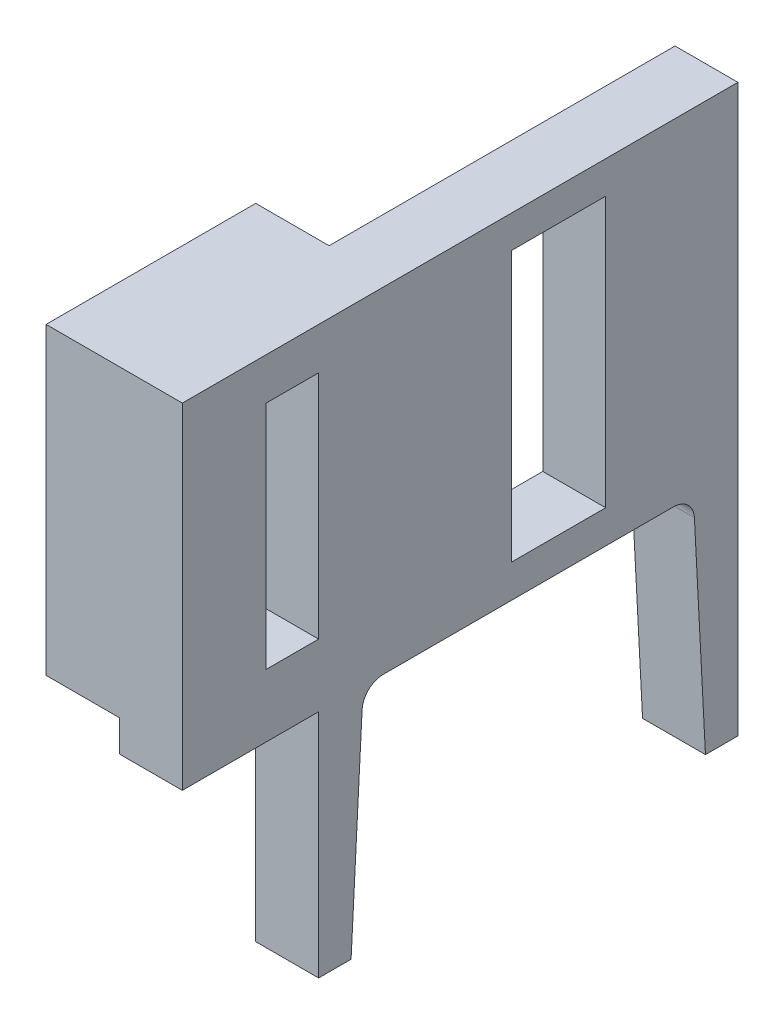
ISO-10303-21;
HEADER;
FILE_DESCRIPTION(('STEP AP214'),'2;1');
FILE_NAME('part.step','',(''),(''),'','','');
FILE_SCHEMA(('AUTOMOTIVE_DESIGN { 1 0 10303 214 1 1 1 1 }'));
ENDSEC;
DATA;
#1=APPLICATION_CONTEXT('core data for automotive mechanical design processes');
#2=APPLICATION_PROTOCOL_DEFINITION('international standard','automotive_design',2000,#1);
#3=PRODUCT_CONTEXT('',#1,'mechanical');
#4=PRODUCT('Part','Part','',(#3));
#5=PRODUCT_RELATED_PRODUCT_CATEGORY('part','',(#4));
#6=PRODUCT_DEFINITION_FORMATION('','',#4);
#7=PRODUCT_DEFINITION_CONTEXT('part definition',#1,'design');
#8=PRODUCT_DEFINITION('design','',#6,#7);
#9=PRODUCT_DEFINITION_SHAPE('','',#8);
#10=(LENGTH_UNIT() NAMED_UNIT(*) SI_UNIT(.MILLI.,.METRE.));
#11=(NAMED_UNIT(*) PLANE_ANGLE_UNIT() SI_UNIT($,.RADIAN.));
#12=(NAMED_UNIT(*) SI_UNIT($,.STERADIAN.) SOLID_ANGLE_UNIT());
#13=UNCERTAINTY_MEASURE_WITH_UNIT(LENGTH_MEASURE(1.E-05),#10,'distance_accuracy_value','');
#14=(GEOMETRIC_REPRESENTATION_CONTEXT(3) GLOBAL_UNCERTAINTY_ASSIGNED_CONTEXT((#13)) GLOBAL_UNIT_ASSIGNED_CONTEXT((#10,
#11,#12)) REPRESENTATION_CONTEXT('',''));
#15=CARTESIAN_POINT('',(0.,0.,0.));
#16=DIRECTION('',(0.,0.,1.));
#17=DIRECTION('',(1.,0.,0.));
#18=AXIS2_PLACEMENT_3D('',#15,#16,#17);
#19=CARTESIAN_POINT('',(13.,-16.,26.5));
#20=DIRECTION('',(0.,1.,0.));
#21=DIRECTION('',(0.,0.,1.));
#22=AXIS2_PLACEMENT_3D('',#19,#20,#21);
#23=PLANE('',#22);
#24=DIRECTION('',(-1.,0.,0.));
#25=VECTOR('',#24,1.);
#26=CARTESIAN_POINT('',(13.,-16.,26.5));
#27=LINE('',#26,#25);
#28=CARTESIAN_POINT('',(13.,-16.,26.5));
#29=VERTEX_POINT('',#28);
#30=CARTESIAN_POINT('',(7.00000000000001,-16.,26.5));
#31=VERTEX_POINT('',#30);
#32=EDGE_CURVE('E444',#29,#31,#27,.T.);
#33=ORIENTED_EDGE('',*,*,#32,.T.);
#34=DIRECTION('',(0.,0.,1.));
#35=VECTOR('',#34,1.);
#36=CARTESIAN_POINT('',(7.00000000000001,-16.,6.49999999999999));
#37=LINE('',#36,#35);
#38=CARTESIAN_POINT('',(7.00000000000001,-16.,13.5));
#39=VERTEX_POINT('',#38);
#40=EDGE_CURVE('E362',#39,#31,#37,.T.);
#41=ORIENTED_EDGE('',*,*,#40,.F.);
#42=DIRECTION('',(-1.,0.,0.));
#43=VECTOR('',#42,1.);
#44=CARTESIAN_POINT('',(13.,-16.,13.5));
#45=LINE('',#44,#43);
#46=CARTESIAN_POINT('',(13.,-16.,13.5));
#47=VERTEX_POINT('',#46);
#48=EDGE_CURVE('E405',#47,#39,#45,.T.);
#49=ORIENTED_EDGE('',*,*,#48,.F.);
#50=DIRECTION('',(0.,0.,-1.));
#51=VECTOR('',#50,1.);
#52=CARTESIAN_POINT('',(13.,-16.,26.5));
#53=LINE('',#52,#51);
#54=EDGE_CURVE('E441',#29,#47,#53,.T.);
#55=ORIENTED_EDGE('',*,*,#54,.F.);
#56=EDGE_LOOP('',(#33,#41,#49,#55));
#57=FACE_BOUND('',#56,.T.);
#58=ADVANCED_FACE('F33',(#57),#23,.F.);
#59=CARTESIAN_POINT('',(0.,0.,0.));
#60=DIRECTION('',(1.,0.,0.));
#61=DIRECTION('',(0.,0.,-1.));
#62=AXIS2_PLACEMENT_3D('',#59,#60,#61);
#63=PLANE('',#62);
#64=DIRECTION('',(0.,0.,1.));
#65=VECTOR('',#64,1.);
#66=CARTESIAN_POINT('',(0.,-10.,13.5));
#67=LINE('',#66,#65);
#68=CARTESIAN_POINT('',(0.,-10.,13.5));
#69=VERTEX_POINT('',#68);
#70=CARTESIAN_POINT('',(0.,-10.,18.5));
#71=VERTEX_POINT('',#70);
#72=EDGE_CURVE('E263',#69,#71,#67,.T.);
#73=ORIENTED_EDGE('',*,*,#72,.F.);
#74=DIRECTION('',(0.,-1.,0.));
#75=VECTOR('',#74,1.);
#76=CARTESIAN_POINT('',(0.,12.,13.5));
#77=LINE('',#76,#75);
#78=CARTESIAN_POINT('',(0.,12.,13.5));
#79=VERTEX_POINT('',#78);
#80=EDGE_CURVE('E48',#79,#69,#77,.T.);
#81=ORIENTED_EDGE('',*,*,#80,.F.);
#82=DIRECTION('',(0.,0.,-1.));
#83=VECTOR('',#82,1.);
#84=CARTESIAN_POINT('',(0.,12.,13.5));
#85=LINE('',#84,#83);
#86=CARTESIAN_POINT('',(0.,12.,18.5));
#87=VERTEX_POINT('',#86);
#88=EDGE_CURVE('E254',#87,#79,#85,.T.);
#89=ORIENTED_EDGE('',*,*,#88,.F.);
#90=DIRECTION('',(0.,1.,0.));
#91=VECTOR('',#90,1.);
#92=CARTESIAN_POINT('',(0.,12.,18.5));
#93=LINE('',#92,#91);
#94=EDGE_CURVE('E257',#71,#87,#93,.T.);
#95=ORIENTED_EDGE('',*,*,#94,.F.);
#96=EDGE_LOOP('',(#73,#81,#89,#95));
#97=FACE_BOUND('',#96,.T.);
#98=DIRECTION('',(0.,0.,-1.));
#99=VECTOR('',#98,1.);
#100=CARTESIAN_POINT('',(0.,-13.,6.49999999999999));
#101=LINE('',#100,#99);
#102=CARTESIAN_POINT('',(0.,-13.,26.5));
#103=VERTEX_POINT('',#102);
#104=CARTESIAN_POINT('',(0.,-13.,6.5));
#105=VERTEX_POINT('',#104);
#106=EDGE_CURVE('E374',#103,#105,#101,.T.);
#107=ORIENTED_EDGE('',*,*,#106,.F.);
#108=DIRECTION('',(0.,-1.,0.));
#109=VECTOR('',#108,1.);
#110=CARTESIAN_POINT('',(0.,16.,26.5));
#111=LINE('',#110,#109);
#112=CARTESIAN_POINT('',(0.,16.,26.5));
#113=VERTEX_POINT('',#112);
#114=EDGE_CURVE('E437',#113,#103,#111,.T.);
#115=ORIENTED_EDGE('',*,*,#114,.F.);
#116=DIRECTION('',(0.,0.,1.));
#117=VECTOR('',#116,1.);
#118=CARTESIAN_POINT('',(0.,16.,26.5));
#119=LINE('',#118,#117);
#120=CARTESIAN_POINT('',(0.,16.,6.49999999999999));
#121=VERTEX_POINT('',#120);
#122=EDGE_CURVE('E432',#121,#113,#119,.T.);
#123=ORIENTED_EDGE('',*,*,#122,.F.);
#124=DIRECTION('',(0.,1.,0.));
#125=VECTOR('',#124,1.);
#126=CARTESIAN_POINT('',(0.,-16.,6.5));
#127=LINE('',#126,#125);
#128=EDGE_CURVE('E386',#105,#121,#127,.T.);
#129=ORIENTED_EDGE('',*,*,#128,.F.);
#130=EDGE_LOOP('',(#107,#115,#123,#129));
#131=FACE_BOUND('',#130,.T.);
#132=ADVANCED_FACE('F538',(#97,#131),#63,.F.);
#133=CARTESIAN_POINT('',(0.,0.,6.5));
#134=DIRECTION('',(0.,0.,1.));
#135=DIRECTION('',(0.,-1.,0.));
#136=AXIS2_PLACEMENT_3D('',#133,#134,#135);
#137=PLANE('',#136);
#138=DIRECTION('',(1.,0.,0.));
#139=VECTOR('',#138,1.);
#140=CARTESIAN_POINT('',(7.00000000000001,-13.,6.49999999999999));
#141=LINE('',#140,#139);
#142=CARTESIAN_POINT('',(7.00000000000001,-13.,6.49999999999999));
#143=VERTEX_POINT('',#142);
#144=EDGE_CURVE('E376',#105,#143,#141,.T.);
#145=ORIENTED_EDGE('',*,*,#144,.F.);
#146=ORIENTED_EDGE('',*,*,#128,.T.);
#147=DIRECTION('',(1.,0.,0.));
#148=VECTOR('',#147,1.);
#149=CARTESIAN_POINT('',(7.00000000000001,16.,6.49999999999999));
#150=LINE('',#149,#148);
#151=CARTESIAN_POINT('',(7.00000000000001,16.,6.49999999999999));
#152=VERTEX_POINT('',#151);
#153=EDGE_CURVE('E388',#121,#152,#150,.T.);
#154=ORIENTED_EDGE('',*,*,#153,.T.);
#155=DIRECTION('',(0.,-1.,0.));
#156=VECTOR('',#155,1.);
#157=CARTESIAN_POINT('',(7.00000000000001,-16.,6.5));
#158=LINE('',#157,#156);
#159=EDGE_CURVE('E383',#152,#143,#158,.T.);
#160=ORIENTED_EDGE('',*,*,#159,.T.);
#161=EDGE_LOOP('',(#145,#146,#154,#160));
#162=FACE_BOUND('',#161,.T.);
#163=ADVANCED_FACE('F540',(#162),#137,.F.);
#164=CARTESIAN_POINT('',(7.,-16.,-26.5));
#165=DIRECTION('',(1.,0.,0.));
#166=DIRECTION('',(0.,0.,-1.));
#167=AXIS2_PLACEMENT_3D('',#164,#165,#166);
#168=PLANE('',#167);
#169=DIRECTION('',(0.,0.,-1.));
#170=VECTOR('',#169,1.);
#171=CARTESIAN_POINT('',(7.,12.9015711105183,-15.8814467422432));
#172=LINE('',#171,#170);
#173=CARTESIAN_POINT('',(7.,12.9015711105183,-15.8814467422432));
#174=VERTEX_POINT('',#173);
#175=CARTESIAN_POINT('',(7.,12.9015711105183,-24.5315578763154));
#176=VERTEX_POINT('',#175);
#177=EDGE_CURVE('E288',#174,#176,#172,.T.);
#178=ORIENTED_EDGE('',*,*,#177,.F.);
#179=DIRECTION('',(0.,1.,0.));
#180=VECTOR('',#179,1.);
#181=CARTESIAN_POINT('',(7.,12.9015711105183,-15.8814467422432));
#182=LINE('',#181,#180);
#183=CARTESIAN_POINT('',(7.,-13.1087867617339,-15.8814467422432));
#184=VERTEX_POINT('',#183);
#185=EDGE_CURVE('E269',#184,#174,#182,.T.);
#186=ORIENTED_EDGE('',*,*,#185,.F.);
#187=DIRECTION('',(0.,0.,1.));
#188=VECTOR('',#187,1.);
#189=CARTESIAN_POINT('',(7.,-13.1087867617339,-15.8814467422432));
#190=LINE('',#189,#188);
#191=CARTESIAN_POINT('',(7.,-13.1087867617339,-24.5315578763154));
#192=VERTEX_POINT('',#191);
#193=EDGE_CURVE('E277',#192,#184,#190,.T.);
#194=ORIENTED_EDGE('',*,*,#193,.F.);
#195=DIRECTION('',(0.,-1.,0.));
#196=VECTOR('',#195,1.);
#197=CARTESIAN_POINT('',(7.,12.9015711105183,-24.5315578763154));
#198=LINE('',#197,#196);
#199=EDGE_CURVE('E291',#176,#192,#198,.T.);
#200=ORIENTED_EDGE('',*,*,#199,.F.);
#201=EDGE_LOOP('',(#178,#186,#194,#200));
#202=FACE_BOUND('',#201,.T.);
#203=DIRECTION('',(0.,0.,1.));
#204=VECTOR('',#203,1.);
#205=CARTESIAN_POINT('',(7.,-13.,-3.61894400909035));
#206=LINE('',#205,#204);
#207=CARTESIAN_POINT('',(7.,-13.,-3.61894400909035));
#208=VERTEX_POINT('',#207);
#209=CARTESIAN_POINT('',(7.,-13.,4.89292863101165));
#210=VERTEX_POINT('',#209);
#211=EDGE_CURVE('E320',#208,#210,#206,.T.);
#212=ORIENTED_EDGE('',*,*,#211,.F.);
#213=DIRECTION('',(0.,-1.,0.));
#214=VECTOR('',#213,1.);
#215=CARTESIAN_POINT('',(7.,12.6981992928279,-3.61894400909035));
#216=LINE('',#215,#214);
#217=CARTESIAN_POINT('',(7.,12.6981992928279,-3.61894400909035));
#218=VERTEX_POINT('',#217);
#219=EDGE_CURVE('E298',#218,#208,#216,.T.);
#220=ORIENTED_EDGE('',*,*,#219,.F.);
#221=DIRECTION('',(0.,0.,-1.));
#222=VECTOR('',#221,1.);
#223=CARTESIAN_POINT('',(7.,12.6981992928279,-3.61894400909035));
#224=LINE('',#223,#222);
#225=CARTESIAN_POINT('',(7.,12.6981992928279,4.89292863101165));
#226=VERTEX_POINT('',#225);
#227=EDGE_CURVE('E309',#226,#218,#224,.T.);
#228=ORIENTED_EDGE('',*,*,#227,.F.);
#229=DIRECTION('',(0.,1.,0.));
#230=VECTOR('',#229,1.);
#231=CARTESIAN_POINT('',(7.,12.6981992928279,4.89292863101165));
#232=LINE('',#231,#230);
#233=EDGE_CURVE('E323',#210,#226,#232,.T.);
#234=ORIENTED_EDGE('',*,*,#233,.F.);
#235=EDGE_LOOP('',(#212,#220,#228,#234));
#236=FACE_BOUND('',#235,.T.);
#237=DIRECTION('',(0.,0.,1.));
#238=VECTOR('',#237,1.);
#239=CARTESIAN_POINT('',(7.,-12.8405154349878,-13.8814467422432));
#240=LINE('',#239,#238);
#241=CARTESIAN_POINT('',(7.,-12.8405154349878,-13.8814467422432));
#242=VERTEX_POINT('',#241);
#243=CARTESIAN_POINT('',(7.,-12.8405154349878,-4.88144674224323));
#244=VERTEX_POINT('',#243);
#245=EDGE_CURVE('E352',#242,#244,#240,.T.);
#246=ORIENTED_EDGE('',*,*,#245,.F.);
#247=DIRECTION('',(0.,-1.,0.));
#248=VECTOR('',#247,1.);
#249=CARTESIAN_POINT('',(7.,12.9015711105183,-13.8814467422432));
#250=LINE('',#249,#248);
#251=CARTESIAN_POINT('',(7.,12.9015711105183,-13.8814467422432));
#252=VERTEX_POINT('',#251);
#253=EDGE_CURVE('E330',#252,#242,#250,.T.);
#254=ORIENTED_EDGE('',*,*,#253,.F.);
#255=DIRECTION('',(0.,0.,-1.));
#256=VECTOR('',#255,1.);
#257=CARTESIAN_POINT('',(7.,12.9015711105183,-13.8814467422432));
#258=LINE('',#257,#256);
#259=CARTESIAN_POINT('',(7.,12.9015711105183,-4.88144674224324));
#260=VERTEX_POINT('',#259);
#261=EDGE_CURVE('E341',#260,#252,#258,.T.);
#262=ORIENTED_EDGE('',*,*,#261,.F.);
#263=DIRECTION('',(0.,1.,0.));
#264=VECTOR('',#263,1.);
#265=CARTESIAN_POINT('',(7.,12.9015711105183,-4.88144674224324));
#266=LINE('',#265,#264);
#267=EDGE_CURVE('E355',#244,#260,#266,.T.);
#268=ORIENTED_EDGE('',*,*,#267,.F.);
#269=EDGE_LOOP('',(#246,#254,#262,#268));
#270=FACE_BOUND('',#269,.T.);
#271=ORIENTED_EDGE('',*,*,#159,.F.);
#272=DIRECTION('',(0.,0.,-1.));
#273=VECTOR('',#272,1.);
#274=CARTESIAN_POINT('',(7.,16.,-26.5));
#275=LINE('',#274,#273);
#276=CARTESIAN_POINT('',(7.,16.,-26.5));
#277=VERTEX_POINT('',#276);
#278=EDGE_CURVE('E427',#152,#277,#275,.T.);
#279=ORIENTED_EDGE('',*,*,#278,.T.);
#280=DIRECTION('',(0.,1.,0.));
#281=VECTOR('',#280,1.);
#282=CARTESIAN_POINT('',(7.,-16.,-26.5));
#283=LINE('',#282,#281);
#284=CARTESIAN_POINT('',(7.,-38.,-26.5));
#285=VERTEX_POINT('',#284);
#286=EDGE_CURVE('E429',#285,#277,#283,.T.);
#287=ORIENTED_EDGE('',*,*,#286,.F.);
#288=DIRECTION('',(0.,0.,-1.));
#289=VECTOR('',#288,1.);
#290=CARTESIAN_POINT('',(7.,-38.,-26.5));
#291=LINE('',#290,#289);
#292=CARTESIAN_POINT('',(7.,-38.,-23.4029711442269));
#293=VERTEX_POINT('',#292);
#294=EDGE_CURVE('E412',#293,#285,#291,.T.);
#295=ORIENTED_EDGE('',*,*,#294,.F.);
#296=DIRECTION('',(0.,0.998629534754574,0.052335956242944));
#297=VECTOR('',#296,1.);
#298=CARTESIAN_POINT('',(7.,-16.2221229844438,-22.2616409723424));
#299=LINE('',#298,#297);
#300=CARTESIAN_POINT('',(7.,-17.8953280875141,-22.3493299360794));
#301=VERTEX_POINT('',#300);
#302=EDGE_CURVE('E395',#301,#293,#299,.F.);
#303=ORIENTED_EDGE('',*,*,#302,.F.);
#304=CARTESIAN_POINT('',(7.,-18.,-20.3520708665702));
#305=DIRECTION('',(1.,0.,0.));
#306=DIRECTION('',(0.,0.,-1.));
#307=AXIS2_PLACEMENT_3D('',#304,#305,#306);
#308=CIRCLE('',#307,2.);
#309=CARTESIAN_POINT('',(7.00000000000001,-16.,-20.3520708665702));
#310=VERTEX_POINT('',#309);
#311=EDGE_CURVE('E470',#310,#301,#308,.F.);
#312=ORIENTED_EDGE('',*,*,#311,.F.);
#313=DIRECTION('',(0.,0.,-1.));
#314=VECTOR('',#313,1.);
#315=CARTESIAN_POINT('',(7.00000000000001,-16.,9.25));
#316=LINE('',#315,#314);
#317=CARTESIAN_POINT('',(7.00000000000001,-16.,7.35207086657024));
#318=VERTEX_POINT('',#317);
#319=EDGE_CURVE('E393',#318,#310,#316,.T.);
#320=ORIENTED_EDGE('',*,*,#319,.F.);
#321=CARTESIAN_POINT('',(7.,-18.,7.35207086657024));
#322=DIRECTION('',(1.,0.,0.));
#323=DIRECTION('',(0.,0.,-1.));
#324=AXIS2_PLACEMENT_3D('',#321,#322,#323);
#325=CIRCLE('',#324,2.);
#326=CARTESIAN_POINT('',(7.,-17.8953280875141,9.34932993607939));
#327=VERTEX_POINT('',#326);
#328=EDGE_CURVE('E11',#327,#318,#325,.F.);
#329=ORIENTED_EDGE('',*,*,#328,.F.);
#330=DIRECTION('',(0.,-0.998629534754574,0.052335956242944));
#331=VECTOR('',#330,1.);
#332=CARTESIAN_POINT('',(7.,-14.1315537190907,9.15207887970789));
#333=LINE('',#332,#331);
#334=CARTESIAN_POINT('',(7.,-38.,10.4029711442269));
#335=VERTEX_POINT('',#334);
#336=EDGE_CURVE('E399',#335,#327,#333,.F.);
#337=ORIENTED_EDGE('',*,*,#336,.F.);
#338=CARTESIAN_POINT('',(7.00000000000001,-38.,13.5));
#339=VERTEX_POINT('',#338);
#340=EDGE_CURVE('E413',#339,#335,#291,.T.);
#341=ORIENTED_EDGE('',*,*,#340,.F.);
#342=DIRECTION('',(0.,1.,0.));
#343=VECTOR('',#342,1.);
#344=CARTESIAN_POINT('',(7.00000000000001,-38.,13.5));
#345=LINE('',#344,#343);
#346=EDGE_CURVE('E419',#339,#39,#345,.T.);
#347=ORIENTED_EDGE('',*,*,#346,.T.);
#348=ORIENTED_EDGE('',*,*,#40,.T.);
#349=DIRECTION('',(0.,-1.,0.));
#350=VECTOR('',#349,1.);
#351=CARTESIAN_POINT('',(7.00000000000001,-13.,26.5));
#352=LINE('',#351,#350);
#353=CARTESIAN_POINT('',(7.00000000000001,-13.,26.5));
#354=VERTEX_POINT('',#353);
#355=EDGE_CURVE('E379',#354,#31,#352,.T.);
#356=ORIENTED_EDGE('',*,*,#355,.F.);
#357=DIRECTION('',(0.,0.,1.));
#358=VECTOR('',#357,1.);
#359=CARTESIAN_POINT('',(7.00000000000001,-13.,6.49999999999999));
#360=LINE('',#359,#358);
#361=EDGE_CURVE('E369',#143,#354,#360,.T.);
#362=ORIENTED_EDGE('',*,*,#361,.F.);
#363=EDGE_LOOP('',(#271,#279,#287,#295,#303,#312,#320,#329,#337,#341,#347,#348,#356,#362));
#364=FACE_BOUND('',#363,.T.);
#365=ADVANCED_FACE('F496',(#202,#236,#270,#364),#168,.F.);
#366=CARTESIAN_POINT('',(0.,-18.,7.35207086657024));
#367=DIRECTION('',(1.,0.,0.));
#368=DIRECTION('',(0.,0.,-1.));
#369=AXIS2_PLACEMENT_3D('',#366,#367,#368);
#370=CYLINDRICAL_SURFACE('',#369,2.);
#371=DIRECTION('',(1.,0.,0.));
#372=VECTOR('',#371,1.);
#373=CARTESIAN_POINT('',(0.,-16.,7.35207086657024));
#374=LINE('',#373,#372);
#375=CARTESIAN_POINT('',(13.,-16.,7.35207086657024));
#376=VERTEX_POINT('',#375);
#377=EDGE_CURVE('E472',#376,#318,#374,.F.);
#378=ORIENTED_EDGE('',*,*,#377,.F.);
#379=CARTESIAN_POINT('',(13.,-18.,7.35207086657024));
#380=DIRECTION('',(1.,0.,0.));
#381=DIRECTION('',(0.,0.,-1.));
#382=AXIS2_PLACEMENT_3D('',#379,#380,#381);
#383=CIRCLE('',#382,2.);
#384=CARTESIAN_POINT('',(13.,-17.8953280875141,9.34932993607939));
#385=VERTEX_POINT('',#384);
#386=EDGE_CURVE('E41',#376,#385,#383,.T.);
#387=ORIENTED_EDGE('',*,*,#386,.T.);
#388=DIRECTION('',(-1.,0.,0.));
#389=VECTOR('',#388,1.);
#390=CARTESIAN_POINT('',(13.,-17.8953280875141,9.34932993607939));
#391=LINE('',#390,#389);
#392=EDGE_CURVE('E475',#327,#385,#391,.F.);
#393=ORIENTED_EDGE('',*,*,#392,.F.);
#394=ORIENTED_EDGE('',*,*,#328,.T.);
#395=EDGE_LOOP('',(#378,#387,#393,#394));
#396=FACE_BOUND('',#395,.T.);
#397=ADVANCED_FACE('F35',(#396),#370,.F.);
#398=CARTESIAN_POINT('',(13.,-18.,-20.3520708665702));
#399=DIRECTION('',(1.,0.,0.));
#400=DIRECTION('',(0.,0.,-1.));
#401=AXIS2_PLACEMENT_3D('',#398,#399,#400);
#402=CYLINDRICAL_SURFACE('',#401,2.);
#403=DIRECTION('',(-1.,0.,0.));
#404=VECTOR('',#403,1.);
#405=CARTESIAN_POINT('',(13.,-17.8953280875141,-22.3493299360794));
#406=LINE('',#405,#404);
#407=CARTESIAN_POINT('',(13.,-17.8953280875141,-22.3493299360794));
#408=VERTEX_POINT('',#407);
#409=EDGE_CURVE('E462',#408,#301,#406,.T.);
#410=ORIENTED_EDGE('',*,*,#409,.F.);
#411=CARTESIAN_POINT('',(13.,-18.,-20.3520708665702));
#412=DIRECTION('',(1.,0.,0.));
#413=DIRECTION('',(0.,0.,-1.));
#414=AXIS2_PLACEMENT_3D('',#411,#412,#413);
#415=CIRCLE('',#414,2.);
#416=CARTESIAN_POINT('',(13.,-16.,-20.3520708665702));
#417=VERTEX_POINT('',#416);
#418=EDGE_CURVE('E468',#408,#417,#415,.T.);
#419=ORIENTED_EDGE('',*,*,#418,.T.);
#420=DIRECTION('',(1.,0.,0.));
#421=VECTOR('',#420,1.);
#422=CARTESIAN_POINT('',(0.,-16.,-20.3520708665702));
#423=LINE('',#422,#421);
#424=EDGE_CURVE('E465',#310,#417,#423,.T.);
#425=ORIENTED_EDGE('',*,*,#424,.F.);
#426=ORIENTED_EDGE('',*,*,#311,.T.);
#427=EDGE_LOOP('',(#410,#419,#425,#426));
#428=FACE_BOUND('',#427,.T.);
#429=ADVANCED_FACE('F506',(#428),#402,.F.);
#430=CARTESIAN_POINT('',(13.,0.,0.));
#431=DIRECTION('',(1.,0.,0.));
#432=DIRECTION('',(0.,0.,-1.));
#433=AXIS2_PLACEMENT_3D('',#430,#431,#432);
#434=PLANE('',#433);
#435=DIRECTION('',(0.,-1.,0.));
#436=VECTOR('',#435,1.);
#437=CARTESIAN_POINT('',(13.,12.,13.5));
#438=LINE('',#437,#436);
#439=CARTESIAN_POINT('',(13.,12.,13.5));
#440=VERTEX_POINT('',#439);
#441=CARTESIAN_POINT('',(13.,-10.,13.5));
#442=VERTEX_POINT('',#441);
#443=EDGE_CURVE('E238',#440,#442,#438,.T.);
#444=ORIENTED_EDGE('',*,*,#443,.T.);
#445=DIRECTION('',(0.,0.,1.));
#446=VECTOR('',#445,1.);
#447=CARTESIAN_POINT('',(13.,-10.,13.5));
#448=LINE('',#447,#446);
#449=CARTESIAN_POINT('',(13.,-10.,18.5));
#450=VERTEX_POINT('',#449);
#451=EDGE_CURVE('E247',#442,#450,#448,.T.);
#452=ORIENTED_EDGE('',*,*,#451,.T.);
#453=DIRECTION('',(0.,1.,0.));
#454=VECTOR('',#453,1.);
#455=CARTESIAN_POINT('',(13.,12.,18.5));
#456=LINE('',#455,#454);
#457=CARTESIAN_POINT('',(13.,12.,18.5));
#458=VERTEX_POINT('',#457);
#459=EDGE_CURVE('E56',#450,#458,#456,.T.);
#460=ORIENTED_EDGE('',*,*,#459,.T.);
#461=DIRECTION('',(0.,0.,-1.));
#462=VECTOR('',#461,1.);
#463=CARTESIAN_POINT('',(13.,12.,13.5));
#464=LINE('',#463,#462);
#465=EDGE_CURVE('E244',#458,#440,#464,.T.);
#466=ORIENTED_EDGE('',*,*,#465,.T.);
#467=EDGE_LOOP('',(#444,#452,#460,#466));
#468=FACE_BOUND('',#467,.T.);
#469=DIRECTION('',(0.,-1.,0.));
#470=VECTOR('',#469,1.);
#471=CARTESIAN_POINT('',(13.,12.9015711105183,-13.8814467422432));
#472=LINE('',#471,#470);
#473=CARTESIAN_POINT('',(13.,12.9015711105183,-13.8814467422432));
#474=VERTEX_POINT('',#473);
#475=CARTESIAN_POINT('',(13.,-12.8405154349878,-13.8814467422432));
#476=VERTEX_POINT('',#475);
#477=EDGE_CURVE('E337',#474,#476,#472,.T.);
#478=ORIENTED_EDGE('',*,*,#477,.T.);
#479=DIRECTION('',(0.,0.,1.));
#480=VECTOR('',#479,1.);
#481=CARTESIAN_POINT('',(13.,-12.8405154349878,-13.8814467422432));
#482=LINE('',#481,#480);
#483=CARTESIAN_POINT('',(13.,-12.8405154349878,-4.88144674224323));
#484=VERTEX_POINT('',#483);
#485=EDGE_CURVE('E340',#476,#484,#482,.T.);
#486=ORIENTED_EDGE('',*,*,#485,.T.);
#487=DIRECTION('',(0.,1.,0.));
#488=VECTOR('',#487,1.);
#489=CARTESIAN_POINT('',(13.,12.9015711105183,-4.88144674224324));
#490=LINE('',#489,#488);
#491=CARTESIAN_POINT('',(13.,12.9015711105183,-4.88144674224324));
#492=VERTEX_POINT('',#491);
#493=EDGE_CURVE('E344',#484,#492,#490,.T.);
#494=ORIENTED_EDGE('',*,*,#493,.T.);
#495=DIRECTION('',(0.,0.,-1.));
#496=VECTOR('',#495,1.);
#497=CARTESIAN_POINT('',(13.,12.9015711105183,-13.8814467422432));
#498=LINE('',#497,#496);
#499=EDGE_CURVE('E347',#492,#474,#498,.T.);
#500=ORIENTED_EDGE('',*,*,#499,.T.);
#501=EDGE_LOOP('',(#478,#486,#494,#500));
#502=FACE_BOUND('',#501,.T.);
#503=ORIENTED_EDGE('',*,*,#418,.F.);
#504=DIRECTION('',(0.,0.998629534754574,0.052335956242944));
#505=VECTOR('',#504,1.);
#506=CARTESIAN_POINT('',(13.,1.11905431679883,-21.3528283798308));
#507=LINE('',#506,#505);
#508=CARTESIAN_POINT('',(13.,-38.,-23.4029711442269));
#509=VERTEX_POINT('',#508);
#510=EDGE_CURVE('E397',#408,#509,#507,.F.);
#511=ORIENTED_EDGE('',*,*,#510,.T.);
#512=DIRECTION('',(0.,0.,1.));
#513=VECTOR('',#512,1.);
#514=CARTESIAN_POINT('',(13.,-38.,-26.5));
#515=LINE('',#514,#513);
#516=CARTESIAN_POINT('',(13.,-38.,-26.5));
#517=VERTEX_POINT('',#516);
#518=EDGE_CURVE('E406',#517,#509,#515,.T.);
#519=ORIENTED_EDGE('',*,*,#518,.F.);
#520=DIRECTION('',(0.,1.,0.));
#521=VECTOR('',#520,1.);
#522=CARTESIAN_POINT('',(13.,16.,-26.5));
#523=LINE('',#522,#521);
#524=CARTESIAN_POINT('',(13.,16.,-26.5));
#525=VERTEX_POINT('',#524);
#526=EDGE_CURVE('E433',#517,#525,#523,.T.);
#527=ORIENTED_EDGE('',*,*,#526,.T.);
#528=DIRECTION('',(0.,0.,1.));
#529=VECTOR('',#528,1.);
#530=CARTESIAN_POINT('',(13.,16.,26.5));
#531=LINE('',#530,#529);
#532=CARTESIAN_POINT('',(13.,16.,26.5));
#533=VERTEX_POINT('',#532);
#534=EDGE_CURVE('E436',#525,#533,#531,.T.);
#535=ORIENTED_EDGE('',*,*,#534,.T.);
#536=DIRECTION('',(0.,-1.,0.));
#537=VECTOR('',#536,1.);
#538=CARTESIAN_POINT('',(13.,16.,26.5));
#539=LINE('',#538,#537);
#540=EDGE_CURVE('E439',#533,#29,#539,.T.);
#541=ORIENTED_EDGE('',*,*,#540,.T.);
#542=ORIENTED_EDGE('',*,*,#54,.T.);
#543=DIRECTION('',(0.,1.,0.));
#544=VECTOR('',#543,1.);
#545=CARTESIAN_POINT('',(13.,-38.,13.5));
#546=LINE('',#545,#544);
#547=CARTESIAN_POINT('',(13.,-38.,13.5));
#548=VERTEX_POINT('',#547);
#549=EDGE_CURVE('E424',#548,#47,#546,.T.);
#550=ORIENTED_EDGE('',*,*,#549,.F.);
#551=CARTESIAN_POINT('',(13.,-38.,10.4029711442269));
#552=VERTEX_POINT('',#551);
#553=EDGE_CURVE('E410',#552,#548,#515,.T.);
#554=ORIENTED_EDGE('',*,*,#553,.F.);
#555=DIRECTION('',(0.,-0.998629534754574,0.052335956242944));
#556=VECTOR('',#555,1.);
#557=CARTESIAN_POINT('',(13.,0.439619305559085,8.38843605993703));
#558=LINE('',#557,#556);
#559=EDGE_CURVE('E402',#552,#385,#558,.F.);
#560=ORIENTED_EDGE('',*,*,#559,.T.);
#561=ORIENTED_EDGE('',*,*,#386,.F.);
#562=DIRECTION('',(0.,0.,1.));
#563=VECTOR('',#562,1.);
#564=CARTESIAN_POINT('',(13.,-16.,9.25));
#565=LINE('',#564,#563);
#566=EDGE_CURVE('E390',#417,#376,#565,.T.);
#567=ORIENTED_EDGE('',*,*,#566,.F.);
#568=EDGE_LOOP('',(#503,#511,#519,#527,#535,#541,#542,#550,#554,#560,#561,#567));
#569=FACE_BOUND('',#568,.T.);
#570=ADVANCED_FACE('F251',(#468,#502,#569),#434,.T.);
#571=CARTESIAN_POINT('',(0.,-38.,0.));
#572=DIRECTION('',(0.,-1.,0.));
#573=DIRECTION('',(0.,0.,-1.));
#574=AXIS2_PLACEMENT_3D('',#571,#572,#573);
#575=PLANE('',#574);
#576=ORIENTED_EDGE('',*,*,#340,.T.);
#577=DIRECTION('',(-1.,0.,0.));
#578=VECTOR('',#577,1.);
#579=CARTESIAN_POINT('',(0.,-38.,10.4029711442269));
#580=LINE('',#579,#578);
#581=EDGE_CURVE('E459',#335,#552,#580,.F.);
#582=ORIENTED_EDGE('',*,*,#581,.T.);
#583=ORIENTED_EDGE('',*,*,#553,.T.);
#584=DIRECTION('',(-1.,0.,0.));
#585=VECTOR('',#584,1.);
#586=CARTESIAN_POINT('',(13.,-38.,13.5));
#587=LINE('',#586,#585);
#588=EDGE_CURVE('E409',#548,#339,#587,.T.);
#589=ORIENTED_EDGE('',*,*,#588,.T.);
#590=EDGE_LOOP('',(#576,#582,#583,#589));
#591=FACE_BOUND('',#590,.T.);
#592=ADVANCED_FACE('F489',(#591),#575,.T.);
#593=ORIENTED_EDGE('',*,*,#518,.T.);
#594=DIRECTION('',(1.,0.,0.));
#595=VECTOR('',#594,1.);
#596=CARTESIAN_POINT('',(0.,-38.,-23.4029711442269));
#597=LINE('',#596,#595);
#598=EDGE_CURVE('E456',#509,#293,#597,.F.);
#599=ORIENTED_EDGE('',*,*,#598,.T.);
#600=ORIENTED_EDGE('',*,*,#294,.T.);
#601=DIRECTION('',(1.,0.,0.));
#602=VECTOR('',#601,1.);
#603=CARTESIAN_POINT('',(13.,-38.,-26.5));
#604=LINE('',#603,#602);
#605=EDGE_CURVE('E416',#285,#517,#604,.T.);
#606=ORIENTED_EDGE('',*,*,#605,.T.);
#607=EDGE_LOOP('',(#593,#599,#600,#606));
#608=FACE_BOUND('',#607,.T.);
#609=ADVANCED_FACE('F512',(#608),#575,.T.);
#610=ORIENTED_EDGE('',*,*,#377,.T.);
#611=ORIENTED_EDGE('',*,*,#319,.T.);
#612=ORIENTED_EDGE('',*,*,#424,.T.);
#613=ORIENTED_EDGE('',*,*,#566,.T.);
#614=EDGE_LOOP('',(#610,#611,#612,#613));
#615=FACE_BOUND('',#614,.T.);
#616=ADVANCED_FACE('F499',(#615),#23,.F.);
#617=CARTESIAN_POINT('',(13.,16.,-26.5));
#618=DIRECTION('',(0.,0.,1.));
#619=DIRECTION('',(1.,0.,0.));
#620=AXIS2_PLACEMENT_3D('',#617,#618,#619);
#621=PLANE('',#620);
#622=ORIENTED_EDGE('',*,*,#526,.F.);
#623=ORIENTED_EDGE('',*,*,#605,.F.);
#624=ORIENTED_EDGE('',*,*,#286,.T.);
#625=DIRECTION('',(-1.,0.,0.));
#626=VECTOR('',#625,1.);
#627=CARTESIAN_POINT('',(13.,16.,-26.5));
#628=LINE('',#627,#626);
#629=EDGE_CURVE('E453',#525,#277,#628,.T.);
#630=ORIENTED_EDGE('',*,*,#629,.F.);
#631=EDGE_LOOP('',(#622,#623,#624,#630));
#632=FACE_BOUND('',#631,.T.);
#633=ADVANCED_FACE('F517',(#632),#621,.F.);
#634=CARTESIAN_POINT('',(13.,16.,26.5));
#635=DIRECTION('',(0.,-1.,0.));
#636=DIRECTION('',(0.,0.,-1.));
#637=AXIS2_PLACEMENT_3D('',#634,#635,#636);
#638=PLANE('',#637);
#639=ORIENTED_EDGE('',*,*,#278,.F.);
#640=ORIENTED_EDGE('',*,*,#153,.F.);
#641=ORIENTED_EDGE('',*,*,#122,.T.);
#642=DIRECTION('',(-1.,0.,0.));
#643=VECTOR('',#642,1.);
#644=CARTESIAN_POINT('',(13.,16.,26.5));
#645=LINE('',#644,#643);
#646=EDGE_CURVE('E450',#533,#113,#645,.T.);
#647=ORIENTED_EDGE('',*,*,#646,.F.);
#648=ORIENTED_EDGE('',*,*,#534,.F.);
#649=ORIENTED_EDGE('',*,*,#629,.T.);
#650=EDGE_LOOP('',(#639,#640,#641,#647,#648,#649));
#651=FACE_BOUND('',#650,.T.);
#652=ADVANCED_FACE('F521',(#651),#638,.F.);
#653=CARTESIAN_POINT('',(13.,16.,26.5));
#654=DIRECTION('',(0.,0.,-1.));
#655=DIRECTION('',(0.,1.,0.));
#656=AXIS2_PLACEMENT_3D('',#653,#654,#655);
#657=PLANE('',#656);
#658=DIRECTION('',(-1.,0.,0.));
#659=VECTOR('',#658,1.);
#660=CARTESIAN_POINT('',(7.00000000000001,-13.,26.5));
#661=LINE('',#660,#659);
#662=EDGE_CURVE('E372',#354,#103,#661,.T.);
#663=ORIENTED_EDGE('',*,*,#662,.F.);
#664=ORIENTED_EDGE('',*,*,#355,.T.);
#665=ORIENTED_EDGE('',*,*,#32,.F.);
#666=ORIENTED_EDGE('',*,*,#540,.F.);
#667=ORIENTED_EDGE('',*,*,#646,.T.);
#668=ORIENTED_EDGE('',*,*,#114,.T.);
#669=EDGE_LOOP('',(#663,#664,#665,#666,#667,#668));
#670=FACE_BOUND('',#669,.T.);
#671=ADVANCED_FACE('F529',(#670),#657,.F.);
#672=CARTESIAN_POINT('',(13.,-38.,13.5));
#673=DIRECTION('',(0.,0.,-1.));
#674=DIRECTION('',(-1.,0.,0.));
#675=AXIS2_PLACEMENT_3D('',#672,#673,#674);
#676=PLANE('',#675);
#677=ORIENTED_EDGE('',*,*,#48,.T.);
#678=ORIENTED_EDGE('',*,*,#346,.F.);
#679=ORIENTED_EDGE('',*,*,#588,.F.);
#680=ORIENTED_EDGE('',*,*,#549,.T.);
#681=EDGE_LOOP('',(#677,#678,#679,#680));
#682=FACE_BOUND('',#681,.T.);
#683=ADVANCED_FACE('F492',(#682),#676,.F.);
#684=CARTESIAN_POINT('',(13.,-16.,9.25));
#685=DIRECTION('',(0.,0.0523359562429439,0.998629534754574));
#686=DIRECTION('',(0.,-0.998629534754574,0.052335956242944));
#687=AXIS2_PLACEMENT_3D('',#684,#685,#686);
#688=PLANE('',#687);
#689=ORIENTED_EDGE('',*,*,#336,.T.);
#690=ORIENTED_EDGE('',*,*,#392,.T.);
#691=ORIENTED_EDGE('',*,*,#559,.F.);
#692=ORIENTED_EDGE('',*,*,#581,.F.);
#693=EDGE_LOOP('',(#689,#690,#691,#692));
#694=FACE_BOUND('',#693,.T.);
#695=ADVANCED_FACE('F483',(#694),#688,.F.);
#696=CARTESIAN_POINT('',(13.,-16.,-22.25));
#697=DIRECTION('',(0.,0.0523359562429439,-0.998629534754574));
#698=DIRECTION('',(0.,0.998629534754574,0.052335956242944));
#699=AXIS2_PLACEMENT_3D('',#696,#697,#698);
#700=PLANE('',#699);
#701=ORIENTED_EDGE('',*,*,#510,.F.);
#702=ORIENTED_EDGE('',*,*,#409,.T.);
#703=ORIENTED_EDGE('',*,*,#302,.T.);
#704=ORIENTED_EDGE('',*,*,#598,.F.);
#705=EDGE_LOOP('',(#701,#702,#703,#704));
#706=FACE_BOUND('',#705,.T.);
#707=ADVANCED_FACE('F509',(#706),#700,.F.);
#708=CARTESIAN_POINT('',(0.,-13.,0.));
#709=DIRECTION('',(0.,-1.,0.));
#710=DIRECTION('',(0.,0.,-1.));
#711=AXIS2_PLACEMENT_3D('',#708,#709,#710);
#712=PLANE('',#711);
#713=ORIENTED_EDGE('',*,*,#361,.T.);
#714=ORIENTED_EDGE('',*,*,#662,.T.);
#715=ORIENTED_EDGE('',*,*,#106,.T.);
#716=ORIENTED_EDGE('',*,*,#144,.T.);
#717=EDGE_LOOP('',(#713,#714,#715,#716));
#718=FACE_BOUND('',#717,.T.);
#719=ADVANCED_FACE('F534',(#718),#712,.T.);
#720=CARTESIAN_POINT('',(13.,12.9015711105183,-13.8814467422432));
#721=DIRECTION('',(0.,0.,-1.));
#722=DIRECTION('',(-1.,0.,0.));
#723=AXIS2_PLACEMENT_3D('',#720,#721,#722);
#724=PLANE('',#723);
#725=ORIENTED_EDGE('',*,*,#253,.T.);
#726=DIRECTION('',(-1.,0.,0.));
#727=VECTOR('',#726,1.);
#728=CARTESIAN_POINT('',(13.,-12.8405154349878,-13.8814467422432));
#729=LINE('',#728,#727);
#730=EDGE_CURVE('E350',#476,#242,#729,.T.);
#731=ORIENTED_EDGE('',*,*,#730,.F.);
#732=ORIENTED_EDGE('',*,*,#477,.F.);
#733=DIRECTION('',(-1.,0.,0.));
#734=VECTOR('',#733,1.);
#735=CARTESIAN_POINT('',(13.,12.9015711105183,-13.8814467422432));
#736=LINE('',#735,#734);
#737=EDGE_CURVE('E360',#474,#252,#736,.T.);
#738=ORIENTED_EDGE('',*,*,#737,.T.);
#739=EDGE_LOOP('',(#725,#731,#732,#738));
#740=FACE_BOUND('',#739,.T.);
#741=ADVANCED_FACE('F606',(#740),#724,.F.);
#742=CARTESIAN_POINT('',(13.,12.9015711105183,-13.8814467422432));
#743=DIRECTION('',(0.,1.,0.));
#744=DIRECTION('',(-1.,0.,0.));
#745=AXIS2_PLACEMENT_3D('',#742,#743,#744);
#746=PLANE('',#745);
#747=ORIENTED_EDGE('',*,*,#261,.T.);
#748=ORIENTED_EDGE('',*,*,#737,.F.);
#749=ORIENTED_EDGE('',*,*,#499,.F.);
#750=DIRECTION('',(-1.,0.,0.));
#751=VECTOR('',#750,1.);
#752=CARTESIAN_POINT('',(13.,12.9015711105183,-4.88144674224324));
#753=LINE('',#752,#751);
#754=EDGE_CURVE('E363',#492,#260,#753,.T.);
#755=ORIENTED_EDGE('',*,*,#754,.T.);
#756=EDGE_LOOP('',(#747,#748,#749,#755));
#757=FACE_BOUND('',#756,.T.);
#758=ADVANCED_FACE('F612',(#757),#746,.F.);
#759=CARTESIAN_POINT('',(13.,12.9015711105183,-4.88144674224324));
#760=DIRECTION('',(0.,0.,1.));
#761=DIRECTION('',(1.,0.,0.));
#762=AXIS2_PLACEMENT_3D('',#759,#760,#761);
#763=PLANE('',#762);
#764=ORIENTED_EDGE('',*,*,#267,.T.);
#765=ORIENTED_EDGE('',*,*,#754,.F.);
#766=ORIENTED_EDGE('',*,*,#493,.F.);
#767=DIRECTION('',(-1.,0.,0.));
#768=VECTOR('',#767,1.);
#769=CARTESIAN_POINT('',(13.,-12.8405154349878,-4.88144674224323));
#770=LINE('',#769,#768);
#771=EDGE_CURVE('E365',#484,#244,#770,.T.);
#772=ORIENTED_EDGE('',*,*,#771,.T.);
#773=EDGE_LOOP('',(#764,#765,#766,#772));
#774=FACE_BOUND('',#773,.T.);
#775=ADVANCED_FACE('F620',(#774),#763,.F.);
#776=CARTESIAN_POINT('',(13.,-12.8405154349878,-13.8814467422432));
#777=DIRECTION('',(0.,-1.,0.));
#778=DIRECTION('',(1.,0.,0.));
#779=AXIS2_PLACEMENT_3D('',#776,#777,#778);
#780=PLANE('',#779);
#781=ORIENTED_EDGE('',*,*,#245,.T.);
#782=ORIENTED_EDGE('',*,*,#771,.F.);
#783=ORIENTED_EDGE('',*,*,#485,.F.);
#784=ORIENTED_EDGE('',*,*,#730,.T.);
#785=EDGE_LOOP('',(#781,#782,#783,#784));
#786=FACE_BOUND('',#785,.T.);
#787=ADVANCED_FACE('F628',(#786),#780,.F.);
#788=CARTESIAN_POINT('',(12.,12.6981992928279,-3.61894400909035));
#789=DIRECTION('',(0.,0.,-1.));
#790=DIRECTION('',(-1.,0.,0.));
#791=AXIS2_PLACEMENT_3D('',#788,#789,#790);
#792=PLANE('',#791);
#793=ORIENTED_EDGE('',*,*,#219,.T.);
#794=DIRECTION('',(-1.,0.,0.));
#795=VECTOR('',#794,1.);
#796=CARTESIAN_POINT('',(12.,-13.,-3.61894400909035));
#797=LINE('',#796,#795);
#798=CARTESIAN_POINT('',(12.,-13.,-3.61894400909035));
#799=VERTEX_POINT('',#798);
#800=EDGE_CURVE('E318',#799,#208,#797,.T.);
#801=ORIENTED_EDGE('',*,*,#800,.F.);
#802=DIRECTION('',(0.,-1.,0.));
#803=VECTOR('',#802,1.);
#804=CARTESIAN_POINT('',(12.,12.6981992928279,-3.61894400909035));
#805=LINE('',#804,#803);
#806=CARTESIAN_POINT('',(12.,12.6981992928279,-3.61894400909035));
#807=VERTEX_POINT('',#806);
#808=EDGE_CURVE('E305',#807,#799,#805,.T.);
#809=ORIENTED_EDGE('',*,*,#808,.F.);
#810=DIRECTION('',(-1.,0.,0.));
#811=VECTOR('',#810,1.);
#812=CARTESIAN_POINT('',(12.,12.6981992928279,-3.61894400909035));
#813=LINE('',#812,#811);
#814=EDGE_CURVE('E328',#807,#218,#813,.T.);
#815=ORIENTED_EDGE('',*,*,#814,.T.);
#816=EDGE_LOOP('',(#793,#801,#809,#815));
#817=FACE_BOUND('',#816,.T.);
#818=ADVANCED_FACE('F636',(#817),#792,.F.);
#819=CARTESIAN_POINT('',(12.,12.6981992928279,-3.61894400909035));
#820=DIRECTION('',(0.,1.,0.));
#821=DIRECTION('',(-1.,0.,0.));
#822=AXIS2_PLACEMENT_3D('',#819,#820,#821);
#823=PLANE('',#822);
#824=ORIENTED_EDGE('',*,*,#227,.T.);
#825=ORIENTED_EDGE('',*,*,#814,.F.);
#826=DIRECTION('',(0.,0.,-1.));
#827=VECTOR('',#826,1.);
#828=CARTESIAN_POINT('',(12.,12.6981992928279,-3.61894400909035));
#829=LINE('',#828,#827);
#830=CARTESIAN_POINT('',(12.,12.6981992928279,4.89292863101165));
#831=VERTEX_POINT('',#830);
#832=EDGE_CURVE('E315',#831,#807,#829,.T.);
#833=ORIENTED_EDGE('',*,*,#832,.F.);
#834=DIRECTION('',(-1.,0.,0.));
#835=VECTOR('',#834,1.);
#836=CARTESIAN_POINT('',(12.,12.6981992928279,4.89292863101165));
#837=LINE('',#836,#835);
#838=EDGE_CURVE('E331',#831,#226,#837,.T.);
#839=ORIENTED_EDGE('',*,*,#838,.T.);
#840=EDGE_LOOP('',(#824,#825,#833,#839));
#841=FACE_BOUND('',#840,.T.);
#842=ADVANCED_FACE('F644',(#841),#823,.F.);
#843=CARTESIAN_POINT('',(12.,12.6981992928279,4.89292863101165));
#844=DIRECTION('',(0.,0.,1.));
#845=DIRECTION('',(1.,0.,0.));
#846=AXIS2_PLACEMENT_3D('',#843,#844,#845);
#847=PLANE('',#846);
#848=ORIENTED_EDGE('',*,*,#233,.T.);
#849=ORIENTED_EDGE('',*,*,#838,.F.);
#850=DIRECTION('',(0.,1.,0.));
#851=VECTOR('',#850,1.);
#852=CARTESIAN_POINT('',(12.,12.6981992928279,4.89292863101165));
#853=LINE('',#852,#851);
#854=CARTESIAN_POINT('',(12.,-13.,4.89292863101165));
#855=VERTEX_POINT('',#854);
#856=EDGE_CURVE('E312',#855,#831,#853,.T.);
#857=ORIENTED_EDGE('',*,*,#856,.F.);
#858=DIRECTION('',(-1.,0.,0.));
#859=VECTOR('',#858,1.);
#860=CARTESIAN_POINT('',(12.,-13.,4.89292863101165));
#861=LINE('',#860,#859);
#862=EDGE_CURVE('E333',#855,#210,#861,.T.);
#863=ORIENTED_EDGE('',*,*,#862,.T.);
#864=EDGE_LOOP('',(#848,#849,#857,#863));
#865=FACE_BOUND('',#864,.T.);
#866=ADVANCED_FACE('F652',(#865),#847,.F.);
#867=CARTESIAN_POINT('',(12.,-13.,-3.61894400909035));
#868=DIRECTION('',(0.,-1.,0.));
#869=DIRECTION('',(1.,0.,0.));
#870=AXIS2_PLACEMENT_3D('',#867,#868,#869);
#871=PLANE('',#870);
#872=ORIENTED_EDGE('',*,*,#211,.T.);
#873=ORIENTED_EDGE('',*,*,#862,.F.);
#874=DIRECTION('',(0.,0.,1.));
#875=VECTOR('',#874,1.);
#876=CARTESIAN_POINT('',(12.,-13.,-3.61894400909035));
#877=LINE('',#876,#875);
#878=EDGE_CURVE('E308',#799,#855,#877,.T.);
#879=ORIENTED_EDGE('',*,*,#878,.F.);
#880=ORIENTED_EDGE('',*,*,#800,.T.);
#881=EDGE_LOOP('',(#872,#873,#879,#880));
#882=FACE_BOUND('',#881,.T.);
#883=ADVANCED_FACE('F660',(#882),#871,.F.);
#884=CARTESIAN_POINT('',(12.,0.,0.));
#885=DIRECTION('',(-1.,0.,0.));
#886=DIRECTION('',(0.,0.,1.));
#887=AXIS2_PLACEMENT_3D('',#884,#885,#886);
#888=PLANE('',#887);
#889=ORIENTED_EDGE('',*,*,#808,.T.);
#890=ORIENTED_EDGE('',*,*,#878,.T.);
#891=ORIENTED_EDGE('',*,*,#856,.T.);
#892=ORIENTED_EDGE('',*,*,#832,.T.);
#893=EDGE_LOOP('',(#889,#890,#891,#892));
#894=FACE_BOUND('',#893,.T.);
#895=ADVANCED_FACE('F668',(#894),#888,.T.);
#896=CARTESIAN_POINT('',(12.,12.9015711105183,-15.8814467422432));
#897=DIRECTION('',(0.,0.,1.));
#898=DIRECTION('',(1.,0.,0.));
#899=AXIS2_PLACEMENT_3D('',#896,#897,#898);
#900=PLANE('',#899);
#901=ORIENTED_EDGE('',*,*,#185,.T.);
#902=DIRECTION('',(-1.,0.,0.));
#903=VECTOR('',#902,1.);
#904=CARTESIAN_POINT('',(12.,12.9015711105183,-15.8814467422432));
#905=LINE('',#904,#903);
#906=CARTESIAN_POINT('',(12.,12.9015711105183,-15.8814467422432));
#907=VERTEX_POINT('',#906);
#908=EDGE_CURVE('E286',#907,#174,#905,.T.);
#909=ORIENTED_EDGE('',*,*,#908,.F.);
#910=DIRECTION('',(0.,1.,0.));
#911=VECTOR('',#910,1.);
#912=CARTESIAN_POINT('',(12.,12.9015711105183,-15.8814467422432));
#913=LINE('',#912,#911);
#914=CARTESIAN_POINT('',(12.,-13.1087867617339,-15.8814467422432));
#915=VERTEX_POINT('',#914);
#916=EDGE_CURVE('E273',#915,#907,#913,.T.);
#917=ORIENTED_EDGE('',*,*,#916,.F.);
#918=DIRECTION('',(-1.,0.,0.));
#919=VECTOR('',#918,1.);
#920=CARTESIAN_POINT('',(12.,-13.1087867617339,-15.8814467422432));
#921=LINE('',#920,#919);
#922=EDGE_CURVE('E296',#915,#184,#921,.T.);
#923=ORIENTED_EDGE('',*,*,#922,.T.);
#924=EDGE_LOOP('',(#901,#909,#917,#923));
#925=FACE_BOUND('',#924,.T.);
#926=ADVANCED_FACE('F676',(#925),#900,.F.);
#927=CARTESIAN_POINT('',(12.,-13.1087867617339,-15.8814467422432));
#928=DIRECTION('',(0.,-1.,0.));
#929=DIRECTION('',(1.,0.,0.));
#930=AXIS2_PLACEMENT_3D('',#927,#928,#929);
#931=PLANE('',#930);
#932=ORIENTED_EDGE('',*,*,#193,.T.);
#933=ORIENTED_EDGE('',*,*,#922,.F.);
#934=DIRECTION('',(0.,0.,1.));
#935=VECTOR('',#934,1.);
#936=CARTESIAN_POINT('',(12.,-13.1087867617339,-15.8814467422432));
#937=LINE('',#936,#935);
#938=CARTESIAN_POINT('',(12.,-13.1087867617339,-24.5315578763154));
#939=VERTEX_POINT('',#938);
#940=EDGE_CURVE('E283',#939,#915,#937,.T.);
#941=ORIENTED_EDGE('',*,*,#940,.F.);
#942=DIRECTION('',(-1.,0.,0.));
#943=VECTOR('',#942,1.);
#944=CARTESIAN_POINT('',(12.,-13.1087867617339,-24.5315578763154));
#945=LINE('',#944,#943);
#946=EDGE_CURVE('E299',#939,#192,#945,.T.);
#947=ORIENTED_EDGE('',*,*,#946,.T.);
#948=EDGE_LOOP('',(#932,#933,#941,#947));
#949=FACE_BOUND('',#948,.T.);
#950=ADVANCED_FACE('F685',(#949),#931,.F.);
#951=CARTESIAN_POINT('',(12.,12.9015711105183,-24.5315578763154));
#952=DIRECTION('',(0.,0.,-1.));
#953=DIRECTION('',(-1.,0.,0.));
#954=AXIS2_PLACEMENT_3D('',#951,#952,#953);
#955=PLANE('',#954);
#956=ORIENTED_EDGE('',*,*,#199,.T.);
#957=ORIENTED_EDGE('',*,*,#946,.F.);
#958=DIRECTION('',(0.,-1.,0.));
#959=VECTOR('',#958,1.);
#960=CARTESIAN_POINT('',(12.,12.9015711105183,-24.5315578763154));
#961=LINE('',#960,#959);
#962=CARTESIAN_POINT('',(12.,12.9015711105183,-24.5315578763154));
#963=VERTEX_POINT('',#962);
#964=EDGE_CURVE('E280',#963,#939,#961,.T.);
#965=ORIENTED_EDGE('',*,*,#964,.F.);
#966=DIRECTION('',(-1.,0.,0.));
#967=VECTOR('',#966,1.);
#968=CARTESIAN_POINT('',(12.,12.9015711105183,-24.5315578763154));
#969=LINE('',#968,#967);
#970=EDGE_CURVE('E301',#963,#176,#969,.T.);
#971=ORIENTED_EDGE('',*,*,#970,.T.);
#972=EDGE_LOOP('',(#956,#957,#965,#971));
#973=FACE_BOUND('',#972,.T.);
#974=ADVANCED_FACE('F693',(#973),#955,.F.);
#975=CARTESIAN_POINT('',(12.,12.9015711105183,-15.8814467422432));
#976=DIRECTION('',(0.,1.,0.));
#977=DIRECTION('',(-1.,0.,0.));
#978=AXIS2_PLACEMENT_3D('',#975,#976,#977);
#979=PLANE('',#978);
#980=ORIENTED_EDGE('',*,*,#177,.T.);
#981=ORIENTED_EDGE('',*,*,#970,.F.);
#982=DIRECTION('',(0.,0.,-1.));
#983=VECTOR('',#982,1.);
#984=CARTESIAN_POINT('',(12.,12.9015711105183,-15.8814467422432));
#985=LINE('',#984,#983);
#986=EDGE_CURVE('E276',#907,#963,#985,.T.);
#987=ORIENTED_EDGE('',*,*,#986,.F.);
#988=ORIENTED_EDGE('',*,*,#908,.T.);
#989=EDGE_LOOP('',(#980,#981,#987,#988));
#990=FACE_BOUND('',#989,.T.);
#991=ADVANCED_FACE('F701',(#990),#979,.F.);
#992=CARTESIAN_POINT('',(12.,0.,0.));
#993=DIRECTION('',(1.,0.,0.));
#994=DIRECTION('',(0.,0.,-1.));
#995=AXIS2_PLACEMENT_3D('',#992,#993,#994);
#996=PLANE('',#995);
#997=ORIENTED_EDGE('',*,*,#916,.T.);
#998=ORIENTED_EDGE('',*,*,#986,.T.);
#999=ORIENTED_EDGE('',*,*,#964,.T.);
#1000=ORIENTED_EDGE('',*,*,#940,.T.);
#1001=EDGE_LOOP('',(#997,#998,#999,#1000));
#1002=FACE_BOUND('',#1001,.T.);
#1003=ADVANCED_FACE('F709',(#1002),#996,.F.);
#1004=CARTESIAN_POINT('',(13.,12.,13.5));
#1005=DIRECTION('',(0.,0.,-1.));
#1006=DIRECTION('',(0.,1.,0.));
#1007=AXIS2_PLACEMENT_3D('',#1004,#1005,#1006);
#1008=PLANE('',#1007);
#1009=ORIENTED_EDGE('',*,*,#80,.T.);
#1010=DIRECTION('',(-1.,0.,0.));
#1011=VECTOR('',#1010,1.);
#1012=CARTESIAN_POINT('',(13.,-10.,13.5));
#1013=LINE('',#1012,#1011);
#1014=EDGE_CURVE('E234',#442,#69,#1013,.T.);
#1015=ORIENTED_EDGE('',*,*,#1014,.F.);
#1016=ORIENTED_EDGE('',*,*,#443,.F.);
#1017=DIRECTION('',(-1.,0.,0.));
#1018=VECTOR('',#1017,1.);
#1019=CARTESIAN_POINT('',(13.,12.,13.5));
#1020=LINE('',#1019,#1018);
#1021=EDGE_CURVE('E267',#440,#79,#1020,.T.);
#1022=ORIENTED_EDGE('',*,*,#1021,.T.);
#1023=EDGE_LOOP('',(#1009,#1015,#1016,#1022));
#1024=FACE_BOUND('',#1023,.T.);
#1025=ADVANCED_FACE('F236',(#1024),#1008,.F.);
#1026=CARTESIAN_POINT('',(13.,12.,13.5));
#1027=DIRECTION('',(0.,1.,0.));
#1028=DIRECTION('',(0.,0.,1.));
#1029=AXIS2_PLACEMENT_3D('',#1026,#1027,#1028);
#1030=PLANE('',#1029);
#1031=ORIENTED_EDGE('',*,*,#88,.T.);
#1032=ORIENTED_EDGE('',*,*,#1021,.F.);
#1033=ORIENTED_EDGE('',*,*,#465,.F.);
#1034=DIRECTION('',(-1.,0.,0.));
#1035=VECTOR('',#1034,1.);
#1036=CARTESIAN_POINT('',(13.,12.,18.5));
#1037=LINE('',#1036,#1035);
#1038=EDGE_CURVE('E270',#458,#87,#1037,.T.);
#1039=ORIENTED_EDGE('',*,*,#1038,.T.);
#1040=EDGE_LOOP('',(#1031,#1032,#1033,#1039));
#1041=FACE_BOUND('',#1040,.T.);
#1042=ADVANCED_FACE('F725',(#1041),#1030,.F.);
#1043=CARTESIAN_POINT('',(13.,12.,18.5));
#1044=DIRECTION('',(0.,0.,1.));
#1045=DIRECTION('',(0.,-1.,0.));
#1046=AXIS2_PLACEMENT_3D('',#1043,#1044,#1045);
#1047=PLANE('',#1046);
#1048=ORIENTED_EDGE('',*,*,#94,.T.);
#1049=ORIENTED_EDGE('',*,*,#1038,.F.);
#1050=ORIENTED_EDGE('',*,*,#459,.F.);
#1051=DIRECTION('',(-1.,0.,0.));
#1052=VECTOR('',#1051,1.);
#1053=CARTESIAN_POINT('',(13.,-10.,18.5));
#1054=LINE('',#1053,#1052);
#1055=EDGE_CURVE('E243',#450,#71,#1054,.T.);
#1056=ORIENTED_EDGE('',*,*,#1055,.T.);
#1057=EDGE_LOOP('',(#1048,#1049,#1050,#1056));
#1058=FACE_BOUND('',#1057,.T.);
#1059=ADVANCED_FACE('F732',(#1058),#1047,.F.);
#1060=CARTESIAN_POINT('',(13.,-10.,13.5));
#1061=DIRECTION('',(0.,-1.,0.));
#1062=DIRECTION('',(0.,0.,-1.));
#1063=AXIS2_PLACEMENT_3D('',#1060,#1061,#1062);
#1064=PLANE('',#1063);
#1065=ORIENTED_EDGE('',*,*,#72,.T.);
#1066=ORIENTED_EDGE('',*,*,#1055,.F.);
#1067=ORIENTED_EDGE('',*,*,#451,.F.);
#1068=ORIENTED_EDGE('',*,*,#1014,.T.);
#1069=EDGE_LOOP('',(#1065,#1066,#1067,#1068));
#1070=FACE_BOUND('',#1069,.T.);
#1071=ADVANCED_FACE('F248',(#1070),#1064,.F.);
#1072=CLOSED_SHELL('',(#58,#132,#163,#365,#397,#429,#570,#592,#609,#616,#633,#652,#671,#683,
#695,#707,#719,#741,#758,#775,#787,#818,#842,#866,#883,#895,#926,#950,#974,#991,#1003,#1025,
#1042,#1059,#1071));
#1073=MANIFOLD_SOLID_BREP('B2',#1072);
#1074=ADVANCED_BREP_SHAPE_REPRESENTATION('',(#18,#1073),#14);
#1075=SHAPE_DEFINITION_REPRESENTATION(#9,#1074);
ENDSEC;
END-ISO-10303-21;
